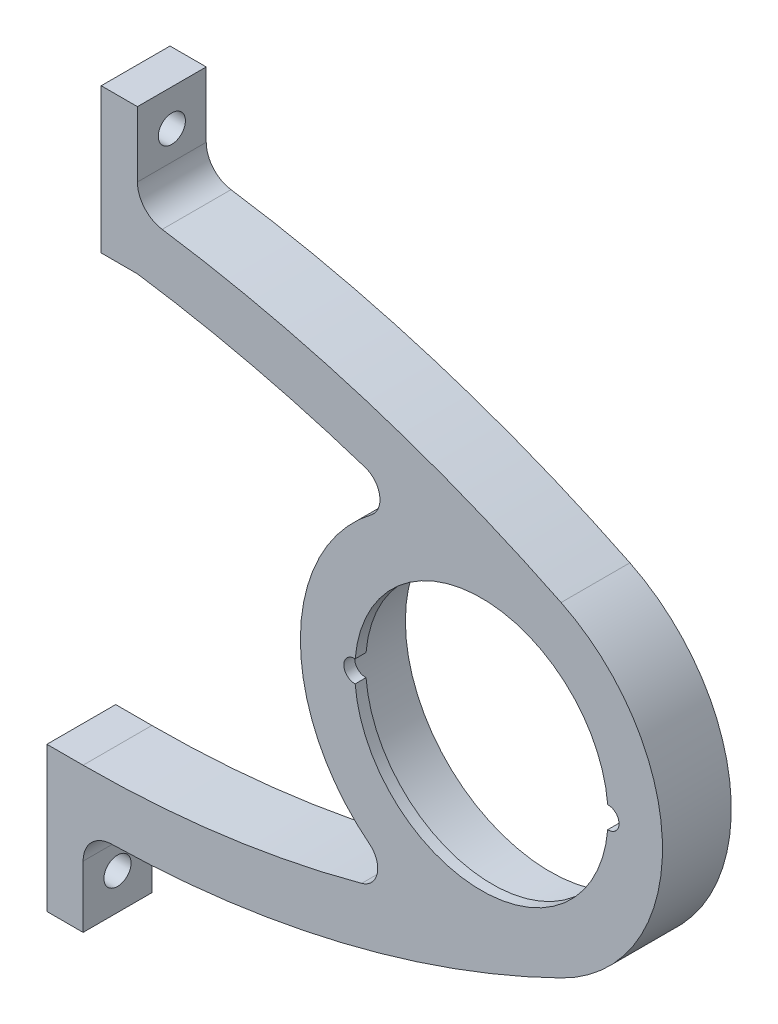
ISO-10303-21;
HEADER;
FILE_DESCRIPTION(('STEP AP214'),'2;1');
FILE_NAME('part.step','',(''),(''),'','','');
FILE_SCHEMA(('AUTOMOTIVE_DESIGN { 1 0 10303 214 1 1 1 1 }'));
ENDSEC;
DATA;
#1=APPLICATION_CONTEXT('core data for automotive mechanical design processes');
#2=APPLICATION_PROTOCOL_DEFINITION('international standard','automotive_design',2000,#1);
#3=PRODUCT_CONTEXT('',#1,'mechanical');
#4=PRODUCT('Part','Part','',(#3));
#5=PRODUCT_RELATED_PRODUCT_CATEGORY('part','',(#4));
#6=PRODUCT_DEFINITION_FORMATION('','',#4);
#7=PRODUCT_DEFINITION_CONTEXT('part definition',#1,'design');
#8=PRODUCT_DEFINITION('design','',#6,#7);
#9=PRODUCT_DEFINITION_SHAPE('','',#8);
#10=(LENGTH_UNIT() NAMED_UNIT(*) SI_UNIT(.MILLI.,.METRE.));
#11=(NAMED_UNIT(*) PLANE_ANGLE_UNIT() SI_UNIT($,.RADIAN.));
#12=(NAMED_UNIT(*) SI_UNIT($,.STERADIAN.) SOLID_ANGLE_UNIT());
#13=UNCERTAINTY_MEASURE_WITH_UNIT(LENGTH_MEASURE(1.E-05),#10,'distance_accuracy_value','');
#14=(GEOMETRIC_REPRESENTATION_CONTEXT(3) GLOBAL_UNCERTAINTY_ASSIGNED_CONTEXT((#13)) GLOBAL_UNIT_ASSIGNED_CONTEXT((#10,
#11,#12)) REPRESENTATION_CONTEXT('',''));
#15=CARTESIAN_POINT('',(0.,0.,0.));
#16=DIRECTION('',(0.,0.,1.));
#17=DIRECTION('',(1.,0.,0.));
#18=AXIS2_PLACEMENT_3D('',#15,#16,#17);
#19=CARTESIAN_POINT('',(0.,0.,24.13));
#20=DIRECTION('',(0.,0.,-1.));
#21=DIRECTION('',(-1.,0.,0.));
#22=AXIS2_PLACEMENT_3D('',#19,#20,#21);
#23=CYLINDRICAL_SURFACE('',#22,50.8);
#24=CARTESIAN_POINT('',(0.,0.,0.));
#25=DIRECTION('',(0.,0.,1.));
#26=DIRECTION('',(1.,0.,0.));
#27=AXIS2_PLACEMENT_3D('',#24,#25,#26);
#28=CIRCLE('',#27,50.8);
#29=CARTESIAN_POINT('',(-50.8,0.,0.));
#30=VERTEX_POINT('',#29);
#31=EDGE_CURVE('E270',#30,#30,#28,.T.);
#32=CARTESIAN_POINT('',(0.,0.,20.32));
#33=DIRECTION('',(0.,0.,1.));
#34=DIRECTION('',(1.,0.,0.));
#35=AXIS2_PLACEMENT_3D('',#32,#33,#34);
#36=CIRCLE('',#35,50.8);
#37=CARTESIAN_POINT('',(-50.8,0.,20.32));
#38=VERTEX_POINT('',#37);
#39=EDGE_CURVE('E252',#38,#38,#36,.T.);
#40=CARTESIAN_POINT('',(-50.8,0.,0.));
#41=CARTESIAN_POINT('',(-50.8,0.,0.211666666666663));
#42=CARTESIAN_POINT('',(-50.8,0.,0.42333333333333));
#43=CARTESIAN_POINT('',(-50.8,0.,0.846666666666663));
#44=CARTESIAN_POINT('',(-50.8,0.,1.05833333333333));
#45=CARTESIAN_POINT('',(-50.8,0.,1.48166666666666));
#46=CARTESIAN_POINT('',(-50.8,0.,1.69333333333333));
#47=CARTESIAN_POINT('',(-50.8,0.,2.11666666666666));
#48=CARTESIAN_POINT('',(-50.8,0.,2.32833333333333));
#49=CARTESIAN_POINT('',(-50.8,0.,2.75166666666666));
#50=CARTESIAN_POINT('',(-50.8,0.,2.96333333333333));
#51=CARTESIAN_POINT('',(-50.8,0.,3.38666666666666));
#52=CARTESIAN_POINT('',(-50.8,0.,3.59833333333333));
#53=CARTESIAN_POINT('',(-50.8,0.,4.02166666666666));
#54=CARTESIAN_POINT('',(-50.8,0.,4.23333333333333));
#55=CARTESIAN_POINT('',(-50.8,0.,4.65666666666666));
#56=CARTESIAN_POINT('',(-50.8,0.,4.86833333333333));
#57=CARTESIAN_POINT('',(-50.8,0.,5.29166666666666));
#58=CARTESIAN_POINT('',(-50.8,0.,5.50333333333333));
#59=CARTESIAN_POINT('',(-50.8,0.,5.92666666666666));
#60=CARTESIAN_POINT('',(-50.8,0.,6.13833333333333));
#61=CARTESIAN_POINT('',(-50.8,0.,6.56166666666666));
#62=CARTESIAN_POINT('',(-50.8,0.,6.77333333333333));
#63=CARTESIAN_POINT('',(-50.8,0.,7.19666666666666));
#64=CARTESIAN_POINT('',(-50.8,0.,7.40833333333333));
#65=CARTESIAN_POINT('',(-50.8,0.,7.83166666666666));
#66=CARTESIAN_POINT('',(-50.8,0.,8.04333333333333));
#67=CARTESIAN_POINT('',(-50.8,0.,8.46666666666666));
#68=CARTESIAN_POINT('',(-50.8,0.,8.67833333333333));
#69=CARTESIAN_POINT('',(-50.8,0.,9.10166666666666));
#70=CARTESIAN_POINT('',(-50.8,0.,9.31333333333333));
#71=CARTESIAN_POINT('',(-50.8,0.,9.73666666666666));
#72=CARTESIAN_POINT('',(-50.8,0.,9.94833333333333));
#73=CARTESIAN_POINT('',(-50.8,0.,10.3716666666667));
#74=CARTESIAN_POINT('',(-50.8,0.,10.5833333333333));
#75=CARTESIAN_POINT('',(-50.8,0.,11.0066666666667));
#76=CARTESIAN_POINT('',(-50.8,0.,11.2183333333333));
#77=CARTESIAN_POINT('',(-50.8,0.,11.6416666666667));
#78=CARTESIAN_POINT('',(-50.8,0.,11.8533333333333));
#79=CARTESIAN_POINT('',(-50.8,0.,12.2766666666667));
#80=CARTESIAN_POINT('',(-50.8,0.,12.4883333333333));
#81=CARTESIAN_POINT('',(-50.8,0.,12.9116666666667));
#82=CARTESIAN_POINT('',(-50.8,0.,13.1233333333333));
#83=CARTESIAN_POINT('',(-50.8,0.,13.5466666666667));
#84=CARTESIAN_POINT('',(-50.8,0.,13.7583333333333));
#85=CARTESIAN_POINT('',(-50.8,0.,14.1816666666667));
#86=CARTESIAN_POINT('',(-50.8,0.,14.3933333333333));
#87=CARTESIAN_POINT('',(-50.8,0.,14.8166666666667));
#88=CARTESIAN_POINT('',(-50.8,0.,15.0283333333333));
#89=CARTESIAN_POINT('',(-50.8,0.,15.4516666666667));
#90=CARTESIAN_POINT('',(-50.8,0.,15.6633333333333));
#91=CARTESIAN_POINT('',(-50.8,0.,16.0866666666667));
#92=CARTESIAN_POINT('',(-50.8,0.,16.2983333333333));
#93=CARTESIAN_POINT('',(-50.8,0.,16.7216666666667));
#94=CARTESIAN_POINT('',(-50.8,0.,16.9333333333333));
#95=CARTESIAN_POINT('',(-50.8,0.,17.3566666666667));
#96=CARTESIAN_POINT('',(-50.8,0.,17.5683333333333));
#97=CARTESIAN_POINT('',(-50.8,0.,17.9916666666667));
#98=CARTESIAN_POINT('',(-50.8,0.,18.2033333333333));
#99=CARTESIAN_POINT('',(-50.8,0.,18.6266666666667));
#100=CARTESIAN_POINT('',(-50.8,0.,18.8383333333333));
#101=CARTESIAN_POINT('',(-50.8,0.,19.2616666666667));
#102=CARTESIAN_POINT('',(-50.8,0.,19.4733333333333));
#103=CARTESIAN_POINT('',(-50.8,0.,19.8966666666667));
#104=CARTESIAN_POINT('',(-50.8,0.,20.1083333333333));
#105=CARTESIAN_POINT('',(-50.8,0.,20.32));
#106=B_SPLINE_CURVE_WITH_KNOTS('',3,(#40,#41,#42,#43,#44,#45,#46,#47,#48,#49,#50,#51,#52,#53,
#54,#55,#56,#57,#58,#59,#60,#61,#62,#63,#64,#65,#66,#67,#68,#69,#70,#71,#72,#73,#74,#75,#76,#77,
#78,#79,#80,#81,#82,#83,#84,#85,#86,#87,#88,#89,#90,#91,#92,#93,#94,#95,#96,#97,#98,#99,#100,
#101,#102,#103,#104,#105),.UNSPECIFIED.,.F.,.F.,(4,2,2,2,2,2,2,2,2,2,2,2,2,2,2,2,2,2,2,2,2,2,2,
2,2,2,2,2,2,2,2,2,4),(0.,0.635,1.27,1.905,2.54,3.175,3.81,4.445,5.08,5.715,6.35,6.985,7.62,
8.255,8.89,9.525,10.16,10.795,11.43,12.065,12.7,13.335,13.97,14.605,15.24,15.875,16.51,17.145,
17.78,18.415,19.05,19.685,20.32),.UNSPECIFIED.);
#107=EDGE_CURVE('BSEAM49',#30,#38,#106,.T.);
#108=ORIENTED_EDGE('',*,*,#31,.F.);
#109=ORIENTED_EDGE('',*,*,#39,.T.);
#110=ORIENTED_EDGE('',*,*,#107,.T.);
#111=ORIENTED_EDGE('',*,*,#107,.F.);
#112=EDGE_LOOP('',(#108,#110,#109,#111));
#113=FACE_BOUND('',#112,.T.);
#114=ADVANCED_FACE('F49',(#113),#23,.F.);
#115=CARTESIAN_POINT('',(-180.92248318278,-369.245424891455,24.13));
#116=DIRECTION('',(0.,0.,1.));
#117=DIRECTION('',(1.,0.,0.));
#118=AXIS2_PLACEMENT_3D('',#115,#116,#117);
#119=PLANE('',#118);
#120=DIRECTION('',(-1.,0.,0.));
#121=VECTOR('',#120,1.);
#122=CARTESIAN_POINT('',(-133.35,133.35,24.13));
#123=LINE('',#122,#121);
#124=CARTESIAN_POINT('',(-120.65,133.35,24.13));
#125=VERTEX_POINT('',#124);
#126=CARTESIAN_POINT('',(-133.35,133.35,24.13));
#127=VERTEX_POINT('',#126);
#128=EDGE_CURVE('E275',#125,#127,#123,.T.);
#129=ORIENTED_EDGE('',*,*,#128,.T.);
#130=DIRECTION('',(0.,-1.,0.));
#131=VECTOR('',#130,1.);
#132=CARTESIAN_POINT('',(-133.35,133.35,24.13));
#133=LINE('',#132,#131);
#134=CARTESIAN_POINT('',(-133.35,82.55,24.13));
#135=VERTEX_POINT('',#134);
#136=EDGE_CURVE('E279',#127,#135,#133,.T.);
#137=ORIENTED_EDGE('',*,*,#136,.T.);
#138=DIRECTION('',(1.,0.,0.));
#139=VECTOR('',#138,1.);
#140=CARTESIAN_POINT('',(-133.35,82.55,24.13));
#141=LINE('',#140,#139);
#142=CARTESIAN_POINT('',(-120.65,82.55,24.13));
#143=VERTEX_POINT('',#142);
#144=EDGE_CURVE('E283',#135,#143,#141,.T.);
#145=ORIENTED_EDGE('',*,*,#144,.T.);
#146=CARTESIAN_POINT('',(-189.24677342047,-387.15487441215,24.13));
#147=DIRECTION('',(0.,0.,-1.));
#148=DIRECTION('',(1.,0.,0.));
#149=AXIS2_PLACEMENT_3D('',#146,#147,#148);
#150=CIRCLE('',#149,474.687461779046);
#151=CARTESIAN_POINT('',(-40.8213667515436,63.7310147276596,24.13));
#152=VERTEX_POINT('',#151);
#153=EDGE_CURVE('E286',#143,#152,#150,.T.);
#154=ORIENTED_EDGE('',*,*,#153,.T.);
#155=CARTESIAN_POINT('',(-43.203990456367,56.4930934596978,24.13));
#156=DIRECTION('',(0.,0.,1.));
#157=DIRECTION('',(1.,0.,0.));
#158=AXIS2_PLACEMENT_3D('',#155,#156,#157);
#159=CIRCLE('',#158,7.62);
#160=CARTESIAN_POINT('',(-38.5749914788991,50.4402620175873,24.13));
#161=VERTEX_POINT('',#160);
#162=EDGE_CURVE('E449',#152,#161,#159,.F.);
#163=ORIENTED_EDGE('',*,*,#162,.T.);
#164=CARTESIAN_POINT('',(0.,0.,24.13));
#165=DIRECTION('',(0.,0.,1.));
#166=DIRECTION('',(1.,0.,0.));
#167=AXIS2_PLACEMENT_3D('',#164,#165,#166);
#168=CIRCLE('',#167,63.5);
#169=CARTESIAN_POINT('',(-39.2720255166367,-49.89947907364,24.13));
#170=VERTEX_POINT('',#169);
#171=EDGE_CURVE('E290',#161,#170,#168,.T.);
#172=ORIENTED_EDGE('',*,*,#171,.T.);
#173=CARTESIAN_POINT('',(-43.9846685786331,-55.8874165624769,24.13));
#174=DIRECTION('',(0.,0.,1.));
#175=DIRECTION('',(1.,0.,0.));
#176=AXIS2_PLACEMENT_3D('',#173,#174,#175);
#177=CIRCLE('',#176,7.62);
#178=CARTESIAN_POINT('',(-41.9986519419431,-63.2440555993463,24.13));
#179=VERTEX_POINT('',#178);
#180=EDGE_CURVE('E11',#170,#179,#177,.F.);
#181=ORIENTED_EDGE('',*,*,#180,.T.);
#182=CARTESIAN_POINT('',(-139.7,298.663059275873,24.13));
#183=DIRECTION('',(0.,0.,-1.));
#184=DIRECTION('',(-1.,0.,0.));
#185=AXIS2_PLACEMENT_3D('',#182,#183,#184);
#186=CIRCLE('',#185,374.863059275873);
#187=CARTESIAN_POINT('',(-139.7,-76.2,24.13));
#188=VERTEX_POINT('',#187);
#189=EDGE_CURVE('E293',#179,#188,#186,.T.);
#190=ORIENTED_EDGE('',*,*,#189,.T.);
#191=DIRECTION('',(-1.,0.,0.));
#192=VECTOR('',#191,1.);
#193=CARTESIAN_POINT('',(-152.4,-76.2,24.13));
#194=LINE('',#193,#192);
#195=CARTESIAN_POINT('',(-152.4,-76.2,24.13));
#196=VERTEX_POINT('',#195);
#197=EDGE_CURVE('E296',#188,#196,#194,.T.);
#198=ORIENTED_EDGE('',*,*,#197,.T.);
#199=DIRECTION('',(0.,-1.,0.));
#200=VECTOR('',#199,1.);
#201=CARTESIAN_POINT('',(-152.4,-76.2,24.13));
#202=LINE('',#201,#200);
#203=CARTESIAN_POINT('',(-152.4,-127.,24.13));
#204=VERTEX_POINT('',#203);
#205=EDGE_CURVE('E299',#196,#204,#202,.T.);
#206=ORIENTED_EDGE('',*,*,#205,.T.);
#207=DIRECTION('',(1.,0.,0.));
#208=VECTOR('',#207,1.);
#209=CARTESIAN_POINT('',(-152.4,-127.,24.13));
#210=LINE('',#209,#208);
#211=CARTESIAN_POINT('',(-139.7,-127.,24.13));
#212=VERTEX_POINT('',#211);
#213=EDGE_CURVE('E302',#204,#212,#210,.T.);
#214=ORIENTED_EDGE('',*,*,#213,.T.);
#215=DIRECTION('',(0.,1.,0.));
#216=VECTOR('',#215,1.);
#217=CARTESIAN_POINT('',(-139.7,-127.,24.13));
#218=LINE('',#217,#216);
#219=CARTESIAN_POINT('',(-139.7,-105.347453165936,24.13));
#220=VERTEX_POINT('',#219);
#221=EDGE_CURVE('E305',#212,#220,#218,.T.);
#222=ORIENTED_EDGE('',*,*,#221,.T.);
#223=CARTESIAN_POINT('',(-129.54,-105.347453165936,24.13));
#224=DIRECTION('',(0.,0.,1.));
#225=DIRECTION('',(1.,0.,0.));
#226=AXIS2_PLACEMENT_3D('',#223,#224,#225);
#227=CIRCLE('',#226,10.16);
#228=CARTESIAN_POINT('',(-129.736848002635,-95.1893602906043,24.13));
#229=VERTEX_POINT('',#228);
#230=EDGE_CURVE('E424',#220,#229,#227,.F.);
#231=ORIENTED_EDGE('',*,*,#230,.T.);
#232=CARTESIAN_POINT('',(-136.999746081384,279.603333769945,24.13));
#233=DIRECTION('',(0.,0.,1.));
#234=DIRECTION('',(1.,0.,0.));
#235=AXIS2_PLACEMENT_3D('',#232,#233,#234);
#236=CIRCLE('',#235,374.863059275873);
#237=CARTESIAN_POINT('',(27.9399999999999,-57.0228585744349,24.13));
#238=VERTEX_POINT('',#237);
#239=EDGE_CURVE('E309',#229,#238,#236,.T.);
#240=ORIENTED_EDGE('',*,*,#239,.T.);
#241=CARTESIAN_POINT('',(0.,0.,24.13));
#242=DIRECTION('',(0.,0.,1.));
#243=DIRECTION('',(1.,0.,0.));
#244=AXIS2_PLACEMENT_3D('',#241,#242,#243);
#245=CIRCLE('',#244,63.5);
#246=CARTESIAN_POINT('',(27.94,57.0228585744349,24.13));
#247=VERTEX_POINT('',#246);
#248=EDGE_CURVE('E312',#238,#247,#245,.T.);
#249=ORIENTED_EDGE('',*,*,#248,.T.);
#250=CARTESIAN_POINT('',(-180.92248318278,-369.245424891455,24.13));
#251=DIRECTION('',(0.,0.,1.));
#252=DIRECTION('',(1.,0.,0.));
#253=AXIS2_PLACEMENT_3D('',#250,#251,#252);
#254=CIRCLE('',#253,474.687461779046);
#255=CARTESIAN_POINT('',(-111.965915799397,100.406763632067,24.13));
#256=VERTEX_POINT('',#255);
#257=EDGE_CURVE('E315',#247,#256,#254,.T.);
#258=ORIENTED_EDGE('',*,*,#257,.T.);
#259=CARTESIAN_POINT('',(-110.49,110.458990875474,24.13));
#260=DIRECTION('',(0.,0.,1.));
#261=DIRECTION('',(1.,0.,0.));
#262=AXIS2_PLACEMENT_3D('',#259,#260,#261);
#263=CIRCLE('',#262,10.16);
#264=CARTESIAN_POINT('',(-120.65,110.458990875474,24.13));
#265=VERTEX_POINT('',#264);
#266=EDGE_CURVE('E430',#256,#265,#263,.F.);
#267=ORIENTED_EDGE('',*,*,#266,.T.);
#268=DIRECTION('',(0.,1.,0.));
#269=VECTOR('',#268,1.);
#270=CARTESIAN_POINT('',(-120.65,133.35,24.13));
#271=LINE('',#270,#269);
#272=EDGE_CURVE('E319',#265,#125,#271,.T.);
#273=ORIENTED_EDGE('',*,*,#272,.T.);
#274=EDGE_LOOP('',(#129,#137,#145,#154,#163,#172,#181,#190,#198,#206,#214,#222,#231,#240,#249,
#258,#267,#273));
#275=FACE_BOUND('',#274,.T.);
#276=CARTESIAN_POINT('',(0.,0.,24.13));
#277=DIRECTION('',(0.,0.,1.));
#278=DIRECTION('',(1.,0.,0.));
#279=AXIS2_PLACEMENT_3D('',#276,#277,#278);
#280=CIRCLE('',#279,44.45);
#281=CARTESIAN_POINT('',(44.2867142857143,3.80649941225665,24.13));
#282=VERTEX_POINT('',#281);
#283=CARTESIAN_POINT('',(-44.2867142857143,3.80649941225665,24.13));
#284=VERTEX_POINT('',#283);
#285=EDGE_CURVE('E207',#282,#284,#280,.T.);
#286=ORIENTED_EDGE('',*,*,#285,.F.);
#287=CARTESIAN_POINT('',(44.45,0.,24.13));
#288=DIRECTION('',(0.,0.,1.));
#289=DIRECTION('',(1.,0.,0.));
#290=AXIS2_PLACEMENT_3D('',#287,#288,#289);
#291=CIRCLE('',#290,3.81);
#292=CARTESIAN_POINT('',(44.2867142857143,-3.80649941225665,24.13));
#293=VERTEX_POINT('',#292);
#294=EDGE_CURVE('E228',#293,#282,#291,.T.);
#295=ORIENTED_EDGE('',*,*,#294,.F.);
#296=CARTESIAN_POINT('',(0.,0.,24.13));
#297=DIRECTION('',(0.,0.,1.));
#298=DIRECTION('',(1.,0.,0.));
#299=AXIS2_PLACEMENT_3D('',#296,#297,#298);
#300=CIRCLE('',#299,44.45);
#301=CARTESIAN_POINT('',(-44.2867142857143,-3.80649941225663,24.13));
#302=VERTEX_POINT('',#301);
#303=EDGE_CURVE('E234',#302,#293,#300,.T.);
#304=ORIENTED_EDGE('',*,*,#303,.F.);
#305=CARTESIAN_POINT('',(-44.45,0.,24.13));
#306=DIRECTION('',(0.,0.,1.));
#307=DIRECTION('',(1.,0.,0.));
#308=AXIS2_PLACEMENT_3D('',#305,#306,#307);
#309=CIRCLE('',#308,3.81);
#310=EDGE_CURVE('E243',#284,#302,#309,.T.);
#311=ORIENTED_EDGE('',*,*,#310,.F.);
#312=EDGE_LOOP('',(#286,#295,#304,#311));
#313=FACE_BOUND('',#312,.T.);
#314=ADVANCED_FACE('F495',(#275,#313),#119,.T.);
#315=CARTESIAN_POINT('',(-180.92248318278,-369.245424891455,0.));
#316=DIRECTION('',(0.,0.,1.));
#317=DIRECTION('',(1.,0.,0.));
#318=AXIS2_PLACEMENT_3D('',#315,#316,#317);
#319=PLANE('',#318);
#320=DIRECTION('',(-1.,0.,0.));
#321=VECTOR('',#320,1.);
#322=CARTESIAN_POINT('',(-133.35,133.35,0.));
#323=LINE('',#322,#321);
#324=CARTESIAN_POINT('',(-120.65,133.35,0.));
#325=VERTEX_POINT('',#324);
#326=CARTESIAN_POINT('',(-133.35,133.35,0.));
#327=VERTEX_POINT('',#326);
#328=EDGE_CURVE('E274',#325,#327,#323,.T.);
#329=ORIENTED_EDGE('',*,*,#328,.F.);
#330=DIRECTION('',(0.,1.,0.));
#331=VECTOR('',#330,1.);
#332=CARTESIAN_POINT('',(-120.65,133.35,0.));
#333=LINE('',#332,#331);
#334=CARTESIAN_POINT('',(-120.65,110.458990875474,0.));
#335=VERTEX_POINT('',#334);
#336=EDGE_CURVE('E280',#335,#325,#333,.T.);
#337=ORIENTED_EDGE('',*,*,#336,.F.);
#338=CARTESIAN_POINT('',(-110.49,110.458990875474,0.));
#339=DIRECTION('',(0.,0.,1.));
#340=DIRECTION('',(1.,0.,0.));
#341=AXIS2_PLACEMENT_3D('',#338,#339,#340);
#342=CIRCLE('',#341,10.16);
#343=CARTESIAN_POINT('',(-111.965915799397,100.406763632067,0.));
#344=VERTEX_POINT('',#343);
#345=EDGE_CURVE('E427',#335,#344,#342,.T.);
#346=ORIENTED_EDGE('',*,*,#345,.T.);
#347=CARTESIAN_POINT('',(-180.92248318278,-369.245424891455,0.));
#348=DIRECTION('',(0.,0.,1.));
#349=DIRECTION('',(1.,0.,0.));
#350=AXIS2_PLACEMENT_3D('',#347,#348,#349);
#351=CIRCLE('',#350,474.687461779046);
#352=CARTESIAN_POINT('',(27.94,57.0228585744349,0.));
#353=VERTEX_POINT('',#352);
#354=EDGE_CURVE('E362',#353,#344,#351,.T.);
#355=ORIENTED_EDGE('',*,*,#354,.F.);
#356=CARTESIAN_POINT('',(0.,0.,0.));
#357=DIRECTION('',(0.,0.,1.));
#358=DIRECTION('',(1.,0.,0.));
#359=AXIS2_PLACEMENT_3D('',#356,#357,#358);
#360=CIRCLE('',#359,63.5);
#361=CARTESIAN_POINT('',(27.9399999999999,-57.0228585744349,0.));
#362=VERTEX_POINT('',#361);
#363=EDGE_CURVE('E359',#362,#353,#360,.T.);
#364=ORIENTED_EDGE('',*,*,#363,.F.);
#365=CARTESIAN_POINT('',(-136.999746081384,279.603333769945,0.));
#366=DIRECTION('',(0.,0.,1.));
#367=DIRECTION('',(1.,0.,0.));
#368=AXIS2_PLACEMENT_3D('',#365,#366,#367);
#369=CIRCLE('',#368,374.863059275873);
#370=CARTESIAN_POINT('',(-129.736848002635,-95.1893602906043,0.));
#371=VERTEX_POINT('',#370);
#372=EDGE_CURVE('E356',#371,#362,#369,.T.);
#373=ORIENTED_EDGE('',*,*,#372,.F.);
#374=CARTESIAN_POINT('',(-129.54,-105.347453165936,0.));
#375=DIRECTION('',(0.,0.,1.));
#376=DIRECTION('',(1.,0.,0.));
#377=AXIS2_PLACEMENT_3D('',#374,#375,#376);
#378=CIRCLE('',#377,10.16);
#379=CARTESIAN_POINT('',(-139.7,-105.347453165936,0.));
#380=VERTEX_POINT('',#379);
#381=EDGE_CURVE('E421',#371,#380,#378,.T.);
#382=ORIENTED_EDGE('',*,*,#381,.T.);
#383=DIRECTION('',(0.,1.,0.));
#384=VECTOR('',#383,1.);
#385=CARTESIAN_POINT('',(-139.7,-127.,0.));
#386=LINE('',#385,#384);
#387=CARTESIAN_POINT('',(-139.7,-127.,0.));
#388=VERTEX_POINT('',#387);
#389=EDGE_CURVE('E352',#388,#380,#386,.T.);
#390=ORIENTED_EDGE('',*,*,#389,.F.);
#391=DIRECTION('',(1.,0.,0.));
#392=VECTOR('',#391,1.);
#393=CARTESIAN_POINT('',(-152.4,-127.,0.));
#394=LINE('',#393,#392);
#395=CARTESIAN_POINT('',(-152.4,-127.,0.));
#396=VERTEX_POINT('',#395);
#397=EDGE_CURVE('E349',#396,#388,#394,.T.);
#398=ORIENTED_EDGE('',*,*,#397,.F.);
#399=DIRECTION('',(0.,-1.,0.));
#400=VECTOR('',#399,1.);
#401=CARTESIAN_POINT('',(-152.4,-76.2,0.));
#402=LINE('',#401,#400);
#403=CARTESIAN_POINT('',(-152.4,-76.2,0.));
#404=VERTEX_POINT('',#403);
#405=EDGE_CURVE('E346',#404,#396,#402,.T.);
#406=ORIENTED_EDGE('',*,*,#405,.F.);
#407=DIRECTION('',(-1.,0.,0.));
#408=VECTOR('',#407,1.);
#409=CARTESIAN_POINT('',(-152.4,-76.2,0.));
#410=LINE('',#409,#408);
#411=CARTESIAN_POINT('',(-139.7,-76.2,0.));
#412=VERTEX_POINT('',#411);
#413=EDGE_CURVE('E343',#412,#404,#410,.T.);
#414=ORIENTED_EDGE('',*,*,#413,.F.);
#415=CARTESIAN_POINT('',(-139.7,298.663059275873,0.));
#416=DIRECTION('',(0.,0.,-1.));
#417=DIRECTION('',(-1.,0.,0.));
#418=AXIS2_PLACEMENT_3D('',#415,#416,#417);
#419=CIRCLE('',#418,374.863059275873);
#420=CARTESIAN_POINT('',(-41.9986519419431,-63.2440555993463,0.));
#421=VERTEX_POINT('',#420);
#422=EDGE_CURVE('E340',#421,#412,#419,.T.);
#423=ORIENTED_EDGE('',*,*,#422,.F.);
#424=CARTESIAN_POINT('',(-43.9846685786331,-55.8874165624769,0.));
#425=DIRECTION('',(0.,0.,1.));
#426=DIRECTION('',(1.,0.,0.));
#427=AXIS2_PLACEMENT_3D('',#424,#425,#426);
#428=CIRCLE('',#427,7.62);
#429=CARTESIAN_POINT('',(-39.2720255166367,-49.89947907364,0.));
#430=VERTEX_POINT('',#429);
#431=EDGE_CURVE('E59',#421,#430,#428,.T.);
#432=ORIENTED_EDGE('',*,*,#431,.T.);
#433=CARTESIAN_POINT('',(0.,0.,0.));
#434=DIRECTION('',(0.,0.,1.));
#435=DIRECTION('',(1.,0.,0.));
#436=AXIS2_PLACEMENT_3D('',#433,#434,#435);
#437=CIRCLE('',#436,63.5);
#438=CARTESIAN_POINT('',(-38.5749914788991,50.4402620175873,0.));
#439=VERTEX_POINT('',#438);
#440=EDGE_CURVE('E336',#439,#430,#437,.T.);
#441=ORIENTED_EDGE('',*,*,#440,.F.);
#442=CARTESIAN_POINT('',(-43.203990456367,56.4930934596978,0.));
#443=DIRECTION('',(0.,0.,1.));
#444=DIRECTION('',(1.,0.,0.));
#445=AXIS2_PLACEMENT_3D('',#442,#443,#444);
#446=CIRCLE('',#445,7.62);
#447=CARTESIAN_POINT('',(-40.8213667515436,63.7310147276596,0.));
#448=VERTEX_POINT('',#447);
#449=EDGE_CURVE('E446',#439,#448,#446,.T.);
#450=ORIENTED_EDGE('',*,*,#449,.T.);
#451=CARTESIAN_POINT('',(-189.24677342047,-387.15487441215,0.));
#452=DIRECTION('',(0.,0.,-1.));
#453=DIRECTION('',(1.,0.,0.));
#454=AXIS2_PLACEMENT_3D('',#451,#452,#453);
#455=CIRCLE('',#454,474.687461779046);
#456=CARTESIAN_POINT('',(-120.65,82.55,0.));
#457=VERTEX_POINT('',#456);
#458=EDGE_CURVE('E332',#457,#448,#455,.T.);
#459=ORIENTED_EDGE('',*,*,#458,.F.);
#460=DIRECTION('',(1.,0.,0.));
#461=VECTOR('',#460,1.);
#462=CARTESIAN_POINT('',(-133.35,82.55,0.));
#463=LINE('',#462,#461);
#464=CARTESIAN_POINT('',(-133.35,82.55,0.));
#465=VERTEX_POINT('',#464);
#466=EDGE_CURVE('E329',#465,#457,#463,.T.);
#467=ORIENTED_EDGE('',*,*,#466,.F.);
#468=DIRECTION('',(0.,-1.,0.));
#469=VECTOR('',#468,1.);
#470=CARTESIAN_POINT('',(-133.35,133.35,0.));
#471=LINE('',#470,#469);
#472=EDGE_CURVE('E326',#327,#465,#471,.T.);
#473=ORIENTED_EDGE('',*,*,#472,.F.);
#474=EDGE_LOOP('',(#329,#337,#346,#355,#364,#373,#382,#390,#398,#406,#414,#423,#432,#441,#450,
#459,#467,#473));
#475=FACE_BOUND('',#474,.T.);
#476=ORIENTED_EDGE('',*,*,#31,.T.);
#477=EDGE_LOOP('',(#476));
#478=FACE_BOUND('',#477,.T.);
#479=ADVANCED_FACE('F483',(#475,#478),#319,.F.);
#480=CARTESIAN_POINT('',(-133.35,133.35,24.13));
#481=DIRECTION('',(0.,-1.,0.));
#482=DIRECTION('',(0.,0.,-1.));
#483=AXIS2_PLACEMENT_3D('',#480,#481,#482);
#484=PLANE('',#483);
#485=ORIENTED_EDGE('',*,*,#328,.T.);
#486=DIRECTION('',(0.,0.,-1.));
#487=VECTOR('',#486,1.);
#488=CARTESIAN_POINT('',(-133.35,133.35,24.13));
#489=LINE('',#488,#487);
#490=EDGE_CURVE('E403',#127,#327,#489,.T.);
#491=ORIENTED_EDGE('',*,*,#490,.F.);
#492=ORIENTED_EDGE('',*,*,#128,.F.);
#493=DIRECTION('',(0.,0.,-1.));
#494=VECTOR('',#493,1.);
#495=CARTESIAN_POINT('',(-120.65,133.35,24.13));
#496=LINE('',#495,#494);
#497=EDGE_CURVE('E322',#125,#325,#496,.T.);
#498=ORIENTED_EDGE('',*,*,#497,.T.);
#499=EDGE_LOOP('',(#485,#491,#492,#498));
#500=FACE_BOUND('',#499,.T.);
#501=ADVANCED_FACE('F472',(#500),#484,.F.);
#502=CARTESIAN_POINT('',(-133.35,133.35,24.13));
#503=DIRECTION('',(1.,0.,0.));
#504=DIRECTION('',(0.,0.,-1.));
#505=AXIS2_PLACEMENT_3D('',#502,#503,#504);
#506=PLANE('',#505);
#507=CARTESIAN_POINT('',(-133.35,120.65,12.065));
#508=DIRECTION('',(1.,0.,0.));
#509=DIRECTION('',(0.,0.,-1.));
#510=AXIS2_PLACEMENT_3D('',#507,#508,#509);
#511=CIRCLE('',#510,4.7625);
#512=CARTESIAN_POINT('',(-133.35,115.8875,12.065));
#513=VERTEX_POINT('',#512);
#514=EDGE_CURVE('E266',#513,#513,#511,.T.);
#515=ORIENTED_EDGE('',*,*,#514,.T.);
#516=EDGE_LOOP('',(#515));
#517=FACE_BOUND('',#516,.T.);
#518=ORIENTED_EDGE('',*,*,#472,.T.);
#519=DIRECTION('',(0.,0.,-1.));
#520=VECTOR('',#519,1.);
#521=CARTESIAN_POINT('',(-133.35,82.55,24.13));
#522=LINE('',#521,#520);
#523=EDGE_CURVE('E399',#135,#465,#522,.T.);
#524=ORIENTED_EDGE('',*,*,#523,.F.);
#525=ORIENTED_EDGE('',*,*,#136,.F.);
#526=ORIENTED_EDGE('',*,*,#490,.T.);
#527=EDGE_LOOP('',(#518,#524,#525,#526));
#528=FACE_BOUND('',#527,.T.);
#529=ADVANCED_FACE('F468',(#517,#528),#506,.F.);
#530=CARTESIAN_POINT('',(-133.35,82.55,24.13));
#531=DIRECTION('',(0.,1.,0.));
#532=DIRECTION('',(0.,0.,1.));
#533=AXIS2_PLACEMENT_3D('',#530,#531,#532);
#534=PLANE('',#533);
#535=ORIENTED_EDGE('',*,*,#466,.T.);
#536=DIRECTION('',(0.,0.,-1.));
#537=VECTOR('',#536,1.);
#538=CARTESIAN_POINT('',(-120.65,82.55,24.13));
#539=LINE('',#538,#537);
#540=EDGE_CURVE('E395',#143,#457,#539,.T.);
#541=ORIENTED_EDGE('',*,*,#540,.F.);
#542=ORIENTED_EDGE('',*,*,#144,.F.);
#543=ORIENTED_EDGE('',*,*,#523,.T.);
#544=EDGE_LOOP('',(#535,#541,#542,#543));
#545=FACE_BOUND('',#544,.T.);
#546=ADVANCED_FACE('F471',(#545),#534,.F.);
#547=CARTESIAN_POINT('',(-189.24677342047,-387.15487441215,24.13));
#548=DIRECTION('',(0.,0.,-1.));
#549=DIRECTION('',(-1.,0.,0.));
#550=AXIS2_PLACEMENT_3D('',#547,#548,#549);
#551=CYLINDRICAL_SURFACE('',#550,474.687461779046);
#552=ORIENTED_EDGE('',*,*,#458,.T.);
#553=DIRECTION('',(0.,0.,-1.));
#554=VECTOR('',#553,1.);
#555=CARTESIAN_POINT('',(-40.8213667515436,63.7310147276596,24.13));
#556=LINE('',#555,#554);
#557=EDGE_CURVE('E440',#448,#152,#556,.F.);
#558=ORIENTED_EDGE('',*,*,#557,.T.);
#559=ORIENTED_EDGE('',*,*,#153,.F.);
#560=ORIENTED_EDGE('',*,*,#540,.T.);
#561=EDGE_LOOP('',(#552,#558,#559,#560));
#562=FACE_BOUND('',#561,.T.);
#563=ADVANCED_FACE('F488',(#562),#551,.F.);
#564=CARTESIAN_POINT('',(0.,0.,24.13));
#565=DIRECTION('',(0.,0.,-1.));
#566=DIRECTION('',(-1.,0.,0.));
#567=AXIS2_PLACEMENT_3D('',#564,#565,#566);
#568=CYLINDRICAL_SURFACE('',#567,63.5);
#569=ORIENTED_EDGE('',*,*,#171,.F.);
#570=DIRECTION('',(0.,0.,-1.));
#571=VECTOR('',#570,1.);
#572=CARTESIAN_POINT('',(-38.5749914788991,50.4402620175873,24.13));
#573=LINE('',#572,#571);
#574=EDGE_CURVE('E436',#161,#439,#573,.T.);
#575=ORIENTED_EDGE('',*,*,#574,.T.);
#576=ORIENTED_EDGE('',*,*,#440,.T.);
#577=DIRECTION('',(0.,0.,-1.));
#578=VECTOR('',#577,1.);
#579=CARTESIAN_POINT('',(-39.2720255166367,-49.89947907364,24.13));
#580=LINE('',#579,#578);
#581=EDGE_CURVE('E433',#430,#170,#580,.F.);
#582=ORIENTED_EDGE('',*,*,#581,.T.);
#583=EDGE_LOOP('',(#569,#575,#576,#582));
#584=FACE_BOUND('',#583,.T.);
#585=ADVANCED_FACE('F498',(#584),#568,.T.);
#586=CARTESIAN_POINT('',(-139.7,298.663059275873,24.13));
#587=DIRECTION('',(0.,0.,-1.));
#588=DIRECTION('',(-1.,0.,0.));
#589=AXIS2_PLACEMENT_3D('',#586,#587,#588);
#590=CYLINDRICAL_SURFACE('',#589,374.863059275873);
#591=ORIENTED_EDGE('',*,*,#189,.F.);
#592=DIRECTION('',(0.,0.,-1.));
#593=VECTOR('',#592,1.);
#594=CARTESIAN_POINT('',(-41.9986519419432,-63.2440555993463,24.13));
#595=LINE('',#594,#593);
#596=EDGE_CURVE('E443',#179,#421,#595,.T.);
#597=ORIENTED_EDGE('',*,*,#596,.T.);
#598=ORIENTED_EDGE('',*,*,#422,.T.);
#599=DIRECTION('',(0.,0.,-1.));
#600=VECTOR('',#599,1.);
#601=CARTESIAN_POINT('',(-139.7,-76.2,24.13));
#602=LINE('',#601,#600);
#603=EDGE_CURVE('E391',#188,#412,#602,.T.);
#604=ORIENTED_EDGE('',*,*,#603,.F.);
#605=EDGE_LOOP('',(#591,#597,#598,#604));
#606=FACE_BOUND('',#605,.T.);
#607=ADVANCED_FACE('F501',(#606),#590,.F.);
#608=CARTESIAN_POINT('',(-152.4,-76.2,24.13));
#609=DIRECTION('',(0.,-1.,0.));
#610=DIRECTION('',(1.,0.,0.));
#611=AXIS2_PLACEMENT_3D('',#608,#609,#610);
#612=PLANE('',#611);
#613=ORIENTED_EDGE('',*,*,#413,.T.);
#614=DIRECTION('',(0.,0.,-1.));
#615=VECTOR('',#614,1.);
#616=CARTESIAN_POINT('',(-152.4,-76.2,24.13));
#617=LINE('',#616,#615);
#618=EDGE_CURVE('E387',#196,#404,#617,.T.);
#619=ORIENTED_EDGE('',*,*,#618,.F.);
#620=ORIENTED_EDGE('',*,*,#197,.F.);
#621=ORIENTED_EDGE('',*,*,#603,.T.);
#622=EDGE_LOOP('',(#613,#619,#620,#621));
#623=FACE_BOUND('',#622,.T.);
#624=ADVANCED_FACE('F508',(#623),#612,.F.);
#625=CARTESIAN_POINT('',(-152.4,-76.2,24.13));
#626=DIRECTION('',(1.,0.,0.));
#627=DIRECTION('',(0.,1.,0.));
#628=AXIS2_PLACEMENT_3D('',#625,#626,#627);
#629=PLANE('',#628);
#630=CARTESIAN_POINT('',(-152.4,-114.3,12.065));
#631=DIRECTION('',(-1.,0.,0.));
#632=DIRECTION('',(0.,-1.,0.));
#633=AXIS2_PLACEMENT_3D('',#630,#631,#632);
#634=CIRCLE('',#633,4.7625);
#635=CARTESIAN_POINT('',(-152.4,-119.0625,12.065));
#636=VERTEX_POINT('',#635);
#637=EDGE_CURVE('E261',#636,#636,#634,.T.);
#638=ORIENTED_EDGE('',*,*,#637,.F.);
#639=EDGE_LOOP('',(#638));
#640=FACE_BOUND('',#639,.T.);
#641=ORIENTED_EDGE('',*,*,#405,.T.);
#642=DIRECTION('',(0.,0.,-1.));
#643=VECTOR('',#642,1.);
#644=CARTESIAN_POINT('',(-152.4,-127.,24.13));
#645=LINE('',#644,#643);
#646=EDGE_CURVE('E383',#204,#396,#645,.T.);
#647=ORIENTED_EDGE('',*,*,#646,.F.);
#648=ORIENTED_EDGE('',*,*,#205,.F.);
#649=ORIENTED_EDGE('',*,*,#618,.T.);
#650=EDGE_LOOP('',(#641,#647,#648,#649));
#651=FACE_BOUND('',#650,.T.);
#652=ADVANCED_FACE('F512',(#640,#651),#629,.F.);
#653=CARTESIAN_POINT('',(-152.4,-127.,24.13));
#654=DIRECTION('',(0.,1.,0.));
#655=DIRECTION('',(0.,0.,1.));
#656=AXIS2_PLACEMENT_3D('',#653,#654,#655);
#657=PLANE('',#656);
#658=ORIENTED_EDGE('',*,*,#397,.T.);
#659=DIRECTION('',(0.,0.,-1.));
#660=VECTOR('',#659,1.);
#661=CARTESIAN_POINT('',(-139.7,-127.,24.13));
#662=LINE('',#661,#660);
#663=EDGE_CURVE('E379',#212,#388,#662,.T.);
#664=ORIENTED_EDGE('',*,*,#663,.F.);
#665=ORIENTED_EDGE('',*,*,#213,.F.);
#666=ORIENTED_EDGE('',*,*,#646,.T.);
#667=EDGE_LOOP('',(#658,#664,#665,#666));
#668=FACE_BOUND('',#667,.T.);
#669=ADVANCED_FACE('F519',(#668),#657,.F.);
#670=CARTESIAN_POINT('',(-139.7,-127.,24.13));
#671=DIRECTION('',(-1.,0.,0.));
#672=DIRECTION('',(0.,0.,1.));
#673=AXIS2_PLACEMENT_3D('',#670,#671,#672);
#674=PLANE('',#673);
#675=CARTESIAN_POINT('',(-139.7,-114.3,12.065));
#676=DIRECTION('',(-1.,0.,0.));
#677=DIRECTION('',(0.,0.,1.));
#678=AXIS2_PLACEMENT_3D('',#675,#676,#677);
#679=CIRCLE('',#678,4.7625);
#680=CARTESIAN_POINT('',(-139.7,-114.3,16.8275));
#681=VERTEX_POINT('',#680);
#682=EDGE_CURVE('E53',#681,#681,#679,.T.);
#683=ORIENTED_EDGE('',*,*,#682,.T.);
#684=EDGE_LOOP('',(#683));
#685=FACE_BOUND('',#684,.T.);
#686=ORIENTED_EDGE('',*,*,#389,.T.);
#687=DIRECTION('',(0.,0.,1.));
#688=VECTOR('',#687,1.);
#689=CARTESIAN_POINT('',(-139.7,-105.347453165936,24.13));
#690=LINE('',#689,#688);
#691=EDGE_CURVE('E411',#380,#220,#690,.T.);
#692=ORIENTED_EDGE('',*,*,#691,.T.);
#693=ORIENTED_EDGE('',*,*,#221,.F.);
#694=ORIENTED_EDGE('',*,*,#663,.T.);
#695=EDGE_LOOP('',(#686,#692,#693,#694));
#696=FACE_BOUND('',#695,.T.);
#697=ADVANCED_FACE('F522',(#685,#696),#674,.F.);
#698=CARTESIAN_POINT('',(-136.999746081384,279.603333769945,24.13));
#699=DIRECTION('',(0.,0.,-1.));
#700=DIRECTION('',(-1.,0.,0.));
#701=AXIS2_PLACEMENT_3D('',#698,#699,#700);
#702=CYLINDRICAL_SURFACE('',#701,374.863059275873);
#703=ORIENTED_EDGE('',*,*,#239,.F.);
#704=DIRECTION('',(0.,0.,-1.));
#705=VECTOR('',#704,1.);
#706=CARTESIAN_POINT('',(-129.736848002635,-95.1893602906043,24.13));
#707=LINE('',#706,#705);
#708=EDGE_CURVE('E407',#229,#371,#707,.T.);
#709=ORIENTED_EDGE('',*,*,#708,.T.);
#710=ORIENTED_EDGE('',*,*,#372,.T.);
#711=DIRECTION('',(0.,0.,-1.));
#712=VECTOR('',#711,1.);
#713=CARTESIAN_POINT('',(27.9399999999999,-57.0228585744349,24.13));
#714=LINE('',#713,#712);
#715=EDGE_CURVE('E375',#238,#362,#714,.T.);
#716=ORIENTED_EDGE('',*,*,#715,.F.);
#717=EDGE_LOOP('',(#703,#709,#710,#716));
#718=FACE_BOUND('',#717,.T.);
#719=ADVANCED_FACE('F530',(#718),#702,.T.);
#720=CARTESIAN_POINT('',(0.,0.,24.13));
#721=DIRECTION('',(0.,0.,-1.));
#722=DIRECTION('',(-1.,0.,0.));
#723=AXIS2_PLACEMENT_3D('',#720,#721,#722);
#724=CYLINDRICAL_SURFACE('',#723,63.5);
#725=ORIENTED_EDGE('',*,*,#363,.T.);
#726=DIRECTION('',(0.,0.,-1.));
#727=VECTOR('',#726,1.);
#728=CARTESIAN_POINT('',(27.94,57.0228585744349,24.13));
#729=LINE('',#728,#727);
#730=EDGE_CURVE('E371',#247,#353,#729,.T.);
#731=ORIENTED_EDGE('',*,*,#730,.F.);
#732=ORIENTED_EDGE('',*,*,#248,.F.);
#733=ORIENTED_EDGE('',*,*,#715,.T.);
#734=EDGE_LOOP('',(#725,#731,#732,#733));
#735=FACE_BOUND('',#734,.T.);
#736=ADVANCED_FACE('F536',(#735),#724,.T.);
#737=CARTESIAN_POINT('',(-180.92248318278,-369.245424891455,24.13));
#738=DIRECTION('',(0.,0.,-1.));
#739=DIRECTION('',(-1.,0.,0.));
#740=AXIS2_PLACEMENT_3D('',#737,#738,#739);
#741=CYLINDRICAL_SURFACE('',#740,474.687461779046);
#742=ORIENTED_EDGE('',*,*,#354,.T.);
#743=DIRECTION('',(0.,0.,-1.));
#744=VECTOR('',#743,1.);
#745=CARTESIAN_POINT('',(-111.965915799397,100.406763632067,24.13));
#746=LINE('',#745,#744);
#747=EDGE_CURVE('E418',#344,#256,#746,.F.);
#748=ORIENTED_EDGE('',*,*,#747,.T.);
#749=ORIENTED_EDGE('',*,*,#257,.F.);
#750=ORIENTED_EDGE('',*,*,#730,.T.);
#751=EDGE_LOOP('',(#742,#748,#749,#750));
#752=FACE_BOUND('',#751,.T.);
#753=ADVANCED_FACE('F568',(#752),#741,.T.);
#754=CARTESIAN_POINT('',(-120.65,133.35,24.13));
#755=DIRECTION('',(-1.,0.,0.));
#756=DIRECTION('',(0.,-1.,0.));
#757=AXIS2_PLACEMENT_3D('',#754,#755,#756);
#758=PLANE('',#757);
#759=CARTESIAN_POINT('',(-120.65,120.65,12.065));
#760=DIRECTION('',(-1.,0.,0.));
#761=DIRECTION('',(0.,-1.,0.));
#762=AXIS2_PLACEMENT_3D('',#759,#760,#761);
#763=CIRCLE('',#762,4.7625);
#764=CARTESIAN_POINT('',(-120.65,115.8875,12.065));
#765=VERTEX_POINT('',#764);
#766=EDGE_CURVE('E265',#765,#765,#763,.T.);
#767=ORIENTED_EDGE('',*,*,#766,.T.);
#768=EDGE_LOOP('',(#767));
#769=FACE_BOUND('',#768,.T.);
#770=ORIENTED_EDGE('',*,*,#272,.F.);
#771=DIRECTION('',(0.,0.,1.));
#772=VECTOR('',#771,1.);
#773=CARTESIAN_POINT('',(-120.65,110.458990875474,0.));
#774=LINE('',#773,#772);
#775=EDGE_CURVE('E414',#265,#335,#774,.F.);
#776=ORIENTED_EDGE('',*,*,#775,.T.);
#777=ORIENTED_EDGE('',*,*,#336,.T.);
#778=ORIENTED_EDGE('',*,*,#497,.F.);
#779=EDGE_LOOP('',(#770,#776,#777,#778));
#780=FACE_BOUND('',#779,.T.);
#781=ADVANCED_FACE('F458',(#769,#780),#758,.F.);
#782=CARTESIAN_POINT('',(-129.54,-105.347453165936,24.13));
#783=DIRECTION('',(0.,0.,-1.));
#784=DIRECTION('',(-1.,0.,0.));
#785=AXIS2_PLACEMENT_3D('',#782,#783,#784);
#786=CYLINDRICAL_SURFACE('',#785,10.16);
#787=ORIENTED_EDGE('',*,*,#230,.F.);
#788=ORIENTED_EDGE('',*,*,#691,.F.);
#789=ORIENTED_EDGE('',*,*,#381,.F.);
#790=ORIENTED_EDGE('',*,*,#708,.F.);
#791=EDGE_LOOP('',(#787,#788,#789,#790));
#792=FACE_BOUND('',#791,.T.);
#793=ADVANCED_FACE('F525',(#792),#786,.F.);
#794=CARTESIAN_POINT('',(-110.49,110.458990875474,24.13));
#795=DIRECTION('',(0.,0.,-1.));
#796=DIRECTION('',(-1.,0.,0.));
#797=AXIS2_PLACEMENT_3D('',#794,#795,#796);
#798=CYLINDRICAL_SURFACE('',#797,10.16);
#799=ORIENTED_EDGE('',*,*,#266,.F.);
#800=ORIENTED_EDGE('',*,*,#747,.F.);
#801=ORIENTED_EDGE('',*,*,#345,.F.);
#802=ORIENTED_EDGE('',*,*,#775,.F.);
#803=EDGE_LOOP('',(#799,#800,#801,#802));
#804=FACE_BOUND('',#803,.T.);
#805=ADVANCED_FACE('F544',(#804),#798,.F.);
#806=CARTESIAN_POINT('',(-43.203990456367,56.4930934596978,24.13));
#807=DIRECTION('',(0.,0.,-1.));
#808=DIRECTION('',(-1.,0.,0.));
#809=AXIS2_PLACEMENT_3D('',#806,#807,#808);
#810=CYLINDRICAL_SURFACE('',#809,7.62);
#811=ORIENTED_EDGE('',*,*,#162,.F.);
#812=ORIENTED_EDGE('',*,*,#557,.F.);
#813=ORIENTED_EDGE('',*,*,#449,.F.);
#814=ORIENTED_EDGE('',*,*,#574,.F.);
#815=EDGE_LOOP('',(#811,#812,#813,#814));
#816=FACE_BOUND('',#815,.T.);
#817=ADVANCED_FACE('F492',(#816),#810,.F.);
#818=CARTESIAN_POINT('',(-43.9846685786331,-55.8874165624769,24.13));
#819=DIRECTION('',(0.,0.,-1.));
#820=DIRECTION('',(-1.,0.,0.));
#821=AXIS2_PLACEMENT_3D('',#818,#819,#820);
#822=CYLINDRICAL_SURFACE('',#821,7.62);
#823=ORIENTED_EDGE('',*,*,#180,.F.);
#824=ORIENTED_EDGE('',*,*,#581,.F.);
#825=ORIENTED_EDGE('',*,*,#431,.F.);
#826=ORIENTED_EDGE('',*,*,#596,.F.);
#827=EDGE_LOOP('',(#823,#824,#825,#826));
#828=FACE_BOUND('',#827,.T.);
#829=ADVANCED_FACE('F51',(#828),#822,.F.);
#830=CARTESIAN_POINT('',(63.5000000000001,120.65,12.065));
#831=DIRECTION('',(-1.,0.,0.));
#832=DIRECTION('',(0.,-1.,0.));
#833=AXIS2_PLACEMENT_3D('',#830,#831,#832);
#834=CYLINDRICAL_SURFACE('',#833,4.7625);
#835=CARTESIAN_POINT('',(-120.65,115.8875,12.065));
#836=CARTESIAN_POINT('',(-120.782291666667,115.8875,12.065));
#837=CARTESIAN_POINT('',(-120.914583333333,115.8875,12.065));
#838=CARTESIAN_POINT('',(-121.179166666667,115.8875,12.065));
#839=CARTESIAN_POINT('',(-121.311458333333,115.8875,12.065));
#840=CARTESIAN_POINT('',(-121.576041666667,115.8875,12.065));
#841=CARTESIAN_POINT('',(-121.708333333333,115.8875,12.065));
#842=CARTESIAN_POINT('',(-121.972916666667,115.8875,12.065));
#843=CARTESIAN_POINT('',(-122.105208333333,115.8875,12.065));
#844=CARTESIAN_POINT('',(-122.369791666667,115.8875,12.065));
#845=CARTESIAN_POINT('',(-122.502083333333,115.8875,12.065));
#846=CARTESIAN_POINT('',(-122.766666666667,115.8875,12.065));
#847=CARTESIAN_POINT('',(-122.898958333333,115.8875,12.065));
#848=CARTESIAN_POINT('',(-123.163541666667,115.8875,12.065));
#849=CARTESIAN_POINT('',(-123.295833333333,115.8875,12.065));
#850=CARTESIAN_POINT('',(-123.560416666667,115.8875,12.065));
#851=CARTESIAN_POINT('',(-123.692708333333,115.8875,12.065));
#852=CARTESIAN_POINT('',(-123.957291666667,115.8875,12.065));
#853=CARTESIAN_POINT('',(-124.089583333333,115.8875,12.065));
#854=CARTESIAN_POINT('',(-124.354166666667,115.8875,12.065));
#855=CARTESIAN_POINT('',(-124.486458333333,115.8875,12.065));
#856=CARTESIAN_POINT('',(-124.751041666667,115.8875,12.065));
#857=CARTESIAN_POINT('',(-124.883333333333,115.8875,12.065));
#858=CARTESIAN_POINT('',(-125.147916666667,115.8875,12.065));
#859=CARTESIAN_POINT('',(-125.280208333333,115.8875,12.065));
#860=CARTESIAN_POINT('',(-125.544791666667,115.8875,12.065));
#861=CARTESIAN_POINT('',(-125.677083333333,115.8875,12.065));
#862=CARTESIAN_POINT('',(-125.941666666667,115.8875,12.065));
#863=CARTESIAN_POINT('',(-126.073958333333,115.8875,12.065));
#864=CARTESIAN_POINT('',(-126.338541666667,115.8875,12.065));
#865=CARTESIAN_POINT('',(-126.470833333333,115.8875,12.065));
#866=CARTESIAN_POINT('',(-126.735416666667,115.8875,12.065));
#867=CARTESIAN_POINT('',(-126.867708333333,115.8875,12.065));
#868=CARTESIAN_POINT('',(-127.132291666667,115.8875,12.065));
#869=CARTESIAN_POINT('',(-127.264583333333,115.8875,12.065));
#870=CARTESIAN_POINT('',(-127.529166666667,115.8875,12.065));
#871=CARTESIAN_POINT('',(-127.661458333333,115.8875,12.065));
#872=CARTESIAN_POINT('',(-127.926041666667,115.8875,12.065));
#873=CARTESIAN_POINT('',(-128.058333333333,115.8875,12.065));
#874=CARTESIAN_POINT('',(-128.322916666667,115.8875,12.065));
#875=CARTESIAN_POINT('',(-128.455208333333,115.8875,12.065));
#876=CARTESIAN_POINT('',(-128.719791666667,115.8875,12.065));
#877=CARTESIAN_POINT('',(-128.852083333333,115.8875,12.065));
#878=CARTESIAN_POINT('',(-129.116666666667,115.8875,12.065));
#879=CARTESIAN_POINT('',(-129.248958333333,115.8875,12.065));
#880=CARTESIAN_POINT('',(-129.513541666667,115.8875,12.065));
#881=CARTESIAN_POINT('',(-129.645833333333,115.8875,12.065));
#882=CARTESIAN_POINT('',(-129.910416666667,115.8875,12.065));
#883=CARTESIAN_POINT('',(-130.042708333333,115.8875,12.065));
#884=CARTESIAN_POINT('',(-130.307291666667,115.8875,12.065));
#885=CARTESIAN_POINT('',(-130.439583333333,115.8875,12.065));
#886=CARTESIAN_POINT('',(-130.704166666667,115.8875,12.065));
#887=CARTESIAN_POINT('',(-130.836458333333,115.8875,12.065));
#888=CARTESIAN_POINT('',(-131.101041666667,115.8875,12.065));
#889=CARTESIAN_POINT('',(-131.233333333333,115.8875,12.065));
#890=CARTESIAN_POINT('',(-131.497916666667,115.8875,12.065));
#891=CARTESIAN_POINT('',(-131.630208333333,115.8875,12.065));
#892=CARTESIAN_POINT('',(-131.894791666667,115.8875,12.065));
#893=CARTESIAN_POINT('',(-132.027083333333,115.8875,12.065));
#894=CARTESIAN_POINT('',(-132.291666666667,115.8875,12.065));
#895=CARTESIAN_POINT('',(-132.423958333333,115.8875,12.065));
#896=CARTESIAN_POINT('',(-132.688541666667,115.8875,12.065));
#897=CARTESIAN_POINT('',(-132.820833333333,115.8875,12.065));
#898=CARTESIAN_POINT('',(-133.085416666667,115.8875,12.065));
#899=CARTESIAN_POINT('',(-133.217708333333,115.8875,12.065));
#900=CARTESIAN_POINT('',(-133.35,115.8875,12.065));
#901=B_SPLINE_CURVE_WITH_KNOTS('',3,(#835,#836,#837,#838,#839,#840,#841,#842,#843,#844,#845,
#846,#847,#848,#849,#850,#851,#852,#853,#854,#855,#856,#857,#858,#859,#860,#861,#862,#863,#864,
#865,#866,#867,#868,#869,#870,#871,#872,#873,#874,#875,#876,#877,#878,#879,#880,#881,#882,#883,
#884,#885,#886,#887,#888,#889,#890,#891,#892,#893,#894,#895,#896,#897,#898,#899,#900),
.UNSPECIFIED.,.F.,.F.,(4,2,2,2,2,2,2,2,2,2,2,2,2,2,2,2,2,2,2,2,2,2,2,2,2,2,2,2,2,2,2,2,4),(0.,
0.396874999999991,0.79375000000001,1.190625,1.58749999999999,1.98437500000001,2.38125,
2.77812499999999,3.17499999999998,3.571875,3.96874999999999,4.36562499999998,4.7625,
5.15937499999999,5.55624999999998,5.953125,6.34999999999999,6.74687499999999,7.14375,7.540625,
7.93749999999999,8.334375,8.73125,9.12812499999999,9.52500000000001,9.921875,10.31875,10.715625,
11.1125,11.509375,11.90625,12.303125,12.7),.UNSPECIFIED.);
#902=EDGE_CURVE('BSEAM461',#765,#513,#901,.T.);
#903=ORIENTED_EDGE('',*,*,#766,.F.);
#904=ORIENTED_EDGE('',*,*,#514,.F.);
#905=ORIENTED_EDGE('',*,*,#902,.T.);
#906=ORIENTED_EDGE('',*,*,#902,.F.);
#907=EDGE_LOOP('',(#903,#905,#904,#906));
#908=FACE_BOUND('',#907,.T.);
#909=ADVANCED_FACE('F461',(#908),#834,.F.);
#910=CARTESIAN_POINT('',(63.5,-114.3,12.065));
#911=DIRECTION('',(-1.,0.,0.));
#912=DIRECTION('',(0.,-1.,0.));
#913=AXIS2_PLACEMENT_3D('',#910,#911,#912);
#914=CYLINDRICAL_SURFACE('',#913,4.7625);
#915=ORIENTED_EDGE('',*,*,#637,.T.);
#916=EDGE_LOOP('',(#915));
#917=FACE_BOUND('',#916,.T.);
#918=ORIENTED_EDGE('',*,*,#682,.F.);
#919=EDGE_LOOP('',(#918));
#920=FACE_BOUND('',#919,.T.);
#921=ADVANCED_FACE('F464',(#917,#920),#914,.F.);
#922=CARTESIAN_POINT('',(0.,0.,20.32));
#923=DIRECTION('',(0.,0.,1.));
#924=DIRECTION('',(1.,0.,0.));
#925=AXIS2_PLACEMENT_3D('',#922,#923,#924);
#926=PLANE('',#925);
#927=CARTESIAN_POINT('',(44.45,0.,20.32));
#928=DIRECTION('',(0.,0.,1.));
#929=DIRECTION('',(1.,0.,0.));
#930=AXIS2_PLACEMENT_3D('',#927,#928,#929);
#931=CIRCLE('',#930,3.81);
#932=CARTESIAN_POINT('',(44.2867142857143,-3.80649941225665,20.32));
#933=VERTEX_POINT('',#932);
#934=CARTESIAN_POINT('',(44.2867142857143,3.80649941225665,20.32));
#935=VERTEX_POINT('',#934);
#936=EDGE_CURVE('E213',#933,#935,#931,.T.);
#937=ORIENTED_EDGE('',*,*,#936,.T.);
#938=CARTESIAN_POINT('',(0.,0.,20.32));
#939=DIRECTION('',(0.,0.,1.));
#940=DIRECTION('',(1.,0.,0.));
#941=AXIS2_PLACEMENT_3D('',#938,#939,#940);
#942=CIRCLE('',#941,44.45);
#943=CARTESIAN_POINT('',(-44.2867142857143,3.80649941225665,20.32));
#944=VERTEX_POINT('',#943);
#945=EDGE_CURVE('E204',#935,#944,#942,.T.);
#946=ORIENTED_EDGE('',*,*,#945,.T.);
#947=CARTESIAN_POINT('',(-44.45,0.,20.32));
#948=DIRECTION('',(0.,0.,1.));
#949=DIRECTION('',(1.,0.,0.));
#950=AXIS2_PLACEMENT_3D('',#947,#948,#949);
#951=CIRCLE('',#950,3.81);
#952=CARTESIAN_POINT('',(-44.2867142857143,-3.80649941225665,20.32));
#953=VERTEX_POINT('',#952);
#954=EDGE_CURVE('E217',#944,#953,#951,.T.);
#955=ORIENTED_EDGE('',*,*,#954,.T.);
#956=CARTESIAN_POINT('',(0.,0.,20.32));
#957=DIRECTION('',(0.,0.,1.));
#958=DIRECTION('',(1.,0.,0.));
#959=AXIS2_PLACEMENT_3D('',#956,#957,#958);
#960=CIRCLE('',#959,44.45);
#961=EDGE_CURVE('E222',#953,#933,#960,.T.);
#962=ORIENTED_EDGE('',*,*,#961,.T.);
#963=EDGE_LOOP('',(#937,#946,#955,#962));
#964=FACE_BOUND('',#963,.T.);
#965=ORIENTED_EDGE('',*,*,#39,.F.);
#966=EDGE_LOOP('',(#965));
#967=FACE_BOUND('',#966,.T.);
#968=ADVANCED_FACE('F224',(#964,#967),#926,.F.);
#969=CARTESIAN_POINT('',(0.,0.,20.32));
#970=DIRECTION('',(0.,0.,1.));
#971=DIRECTION('',(1.,0.,0.));
#972=AXIS2_PLACEMENT_3D('',#969,#970,#971);
#973=CYLINDRICAL_SURFACE('',#972,44.45);
#974=ORIENTED_EDGE('',*,*,#285,.T.);
#975=DIRECTION('',(0.,0.,1.));
#976=VECTOR('',#975,1.);
#977=CARTESIAN_POINT('',(-44.2867142857143,3.80649941225665,20.32));
#978=LINE('',#977,#976);
#979=EDGE_CURVE('E200',#944,#284,#978,.T.);
#980=ORIENTED_EDGE('',*,*,#979,.F.);
#981=ORIENTED_EDGE('',*,*,#945,.F.);
#982=DIRECTION('',(0.,0.,1.));
#983=VECTOR('',#982,1.);
#984=CARTESIAN_POINT('',(44.2867142857143,3.80649941225665,20.32));
#985=LINE('',#984,#983);
#986=EDGE_CURVE('E249',#935,#282,#985,.T.);
#987=ORIENTED_EDGE('',*,*,#986,.T.);
#988=EDGE_LOOP('',(#974,#980,#981,#987));
#989=FACE_BOUND('',#988,.T.);
#990=ADVANCED_FACE('F202',(#989),#973,.F.);
#991=CARTESIAN_POINT('',(44.45,0.,20.32));
#992=DIRECTION('',(0.,0.,1.));
#993=DIRECTION('',(1.,0.,0.));
#994=AXIS2_PLACEMENT_3D('',#991,#992,#993);
#995=CYLINDRICAL_SURFACE('',#994,3.81);
#996=ORIENTED_EDGE('',*,*,#294,.T.);
#997=ORIENTED_EDGE('',*,*,#986,.F.);
#998=ORIENTED_EDGE('',*,*,#936,.F.);
#999=DIRECTION('',(0.,0.,1.));
#1000=VECTOR('',#999,1.);
#1001=CARTESIAN_POINT('',(44.2867142857143,-3.80649941225665,20.32));
#1002=LINE('',#1001,#1000);
#1003=EDGE_CURVE('E253',#933,#293,#1002,.T.);
#1004=ORIENTED_EDGE('',*,*,#1003,.T.);
#1005=EDGE_LOOP('',(#996,#997,#998,#1004));
#1006=FACE_BOUND('',#1005,.T.);
#1007=ADVANCED_FACE('F664',(#1006),#995,.F.);
#1008=CARTESIAN_POINT('',(0.,0.,20.32));
#1009=DIRECTION('',(0.,0.,1.));
#1010=DIRECTION('',(1.,0.,0.));
#1011=AXIS2_PLACEMENT_3D('',#1008,#1009,#1010);
#1012=CYLINDRICAL_SURFACE('',#1011,44.45);
#1013=ORIENTED_EDGE('',*,*,#303,.T.);
#1014=ORIENTED_EDGE('',*,*,#1003,.F.);
#1015=ORIENTED_EDGE('',*,*,#961,.F.);
#1016=DIRECTION('',(0.,0.,1.));
#1017=VECTOR('',#1016,1.);
#1018=CARTESIAN_POINT('',(-44.2867142857143,-3.80649941225663,20.32));
#1019=LINE('',#1018,#1017);
#1020=EDGE_CURVE('E212',#953,#302,#1019,.T.);
#1021=ORIENTED_EDGE('',*,*,#1020,.T.);
#1022=EDGE_LOOP('',(#1013,#1014,#1015,#1021));
#1023=FACE_BOUND('',#1022,.T.);
#1024=ADVANCED_FACE('F670',(#1023),#1012,.F.);
#1025=CARTESIAN_POINT('',(-44.45,0.,20.32));
#1026=DIRECTION('',(0.,0.,1.));
#1027=DIRECTION('',(1.,0.,0.));
#1028=AXIS2_PLACEMENT_3D('',#1025,#1026,#1027);
#1029=CYLINDRICAL_SURFACE('',#1028,3.81);
#1030=ORIENTED_EDGE('',*,*,#310,.T.);
#1031=ORIENTED_EDGE('',*,*,#1020,.F.);
#1032=ORIENTED_EDGE('',*,*,#954,.F.);
#1033=ORIENTED_EDGE('',*,*,#979,.T.);
#1034=EDGE_LOOP('',(#1030,#1031,#1032,#1033));
#1035=FACE_BOUND('',#1034,.T.);
#1036=ADVANCED_FACE('F218',(#1035),#1029,.F.);
#1037=CLOSED_SHELL('',(#114,#314,#479,#501,#529,#546,#563,#585,#607,#624,#652,#669,#697,#719,
#736,#753,#781,#793,#805,#817,#829,#909,#921,#968,#990,#1007,#1024,#1036));
#1038=MANIFOLD_SOLID_BREP('B2',#1037);
#1039=ADVANCED_BREP_SHAPE_REPRESENTATION('',(#18,#1038),#14);
#1040=SHAPE_DEFINITION_REPRESENTATION(#9,#1039);
ENDSEC;
END-ISO-10303-21;
